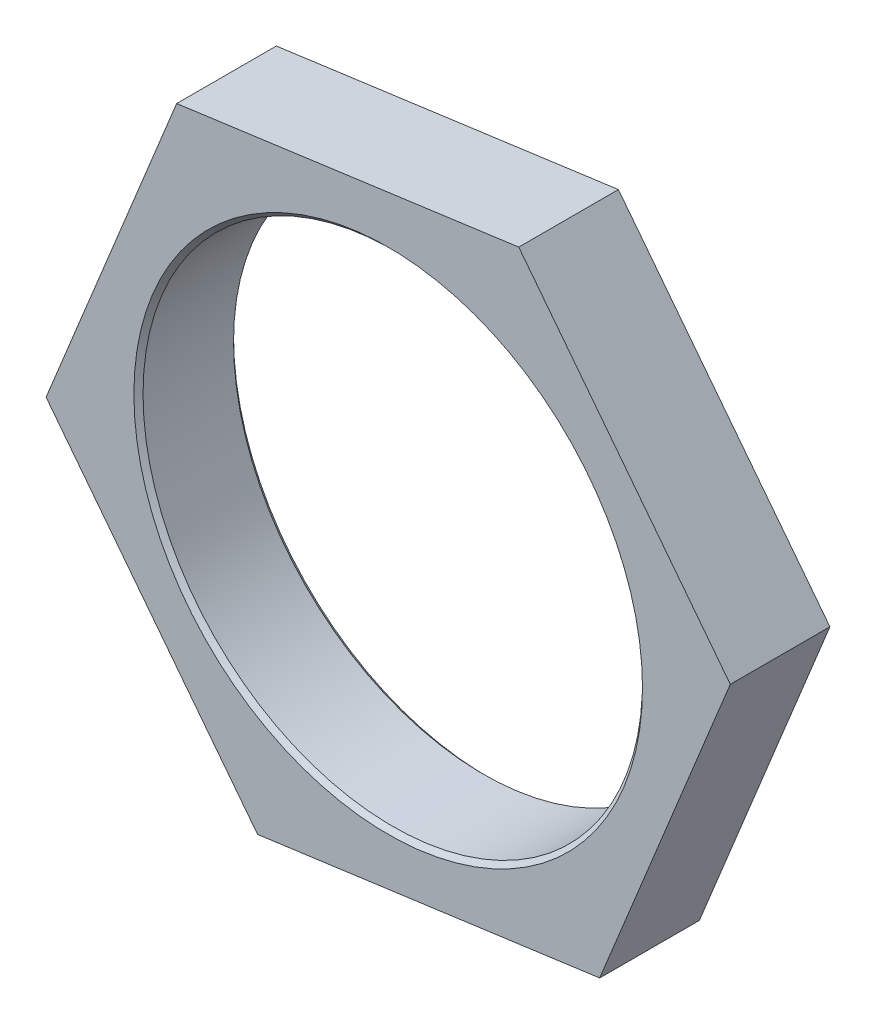
ISO-10303-21;
HEADER;
FILE_DESCRIPTION(('STEP AP214'),'2;1');
FILE_NAME('part.step','',(''),(''),'','','');
FILE_SCHEMA(('AUTOMOTIVE_DESIGN { 1 0 10303 214 1 1 1 1 }'));
ENDSEC;
DATA;
#1=APPLICATION_CONTEXT('core data for automotive mechanical design processes');
#2=APPLICATION_PROTOCOL_DEFINITION('international standard','automotive_design',2000,#1);
#3=PRODUCT_CONTEXT('',#1,'mechanical');
#4=PRODUCT('Part','Part','',(#3));
#5=PRODUCT_RELATED_PRODUCT_CATEGORY('part','',(#4));
#6=PRODUCT_DEFINITION_FORMATION('','',#4);
#7=PRODUCT_DEFINITION_CONTEXT('part definition',#1,'design');
#8=PRODUCT_DEFINITION('design','',#6,#7);
#9=PRODUCT_DEFINITION_SHAPE('','',#8);
#10=(LENGTH_UNIT() NAMED_UNIT(*) SI_UNIT(.MILLI.,.METRE.));
#11=(NAMED_UNIT(*) PLANE_ANGLE_UNIT() SI_UNIT($,.RADIAN.));
#12=(NAMED_UNIT(*) SI_UNIT($,.STERADIAN.) SOLID_ANGLE_UNIT());
#13=UNCERTAINTY_MEASURE_WITH_UNIT(LENGTH_MEASURE(1.E-05),#10,'distance_accuracy_value','');
#14=(GEOMETRIC_REPRESENTATION_CONTEXT(3) GLOBAL_UNCERTAINTY_ASSIGNED_CONTEXT((#13)) GLOBAL_UNIT_ASSIGNED_CONTEXT((#10,
#11,#12)) REPRESENTATION_CONTEXT('',''));
#15=CARTESIAN_POINT('',(0.,0.,0.));
#16=DIRECTION('',(0.,0.,1.));
#17=DIRECTION('',(1.,0.,0.));
#18=AXIS2_PLACEMENT_3D('',#15,#16,#17);
#19=CARTESIAN_POINT('',(0.,0.,-5.7));
#20=DIRECTION('',(0.,0.,-1.));
#21=DIRECTION('',(1.,0.,0.));
#22=AXIS2_PLACEMENT_3D('',#19,#20,#21);
#23=CONICAL_SURFACE('',#22,5.77,0.785398163397449);
#24=CARTESIAN_POINT('',(0.,0.,-5.69435));
#25=DIRECTION('',(0.,0.,1.));
#26=DIRECTION('',(1.,0.,0.));
#27=AXIS2_PLACEMENT_3D('',#24,#25,#26);
#28=CIRCLE('',#27,5.76435);
#29=CARTESIAN_POINT('',(-5.76435,0.,-5.69435));
#30=VERTEX_POINT('',#29);
#31=EDGE_CURVE('E10',#30,#30,#28,.T.);
#32=ORIENTED_EDGE('',*,*,#31,.T.);
#33=DIRECTION('',(-0.707106781186548,0.,-0.707106781186547));
#34=VECTOR('',#33,1.);
#35=CARTESIAN_POINT('',(-5.77,0.,-5.7));
#36=LINE('',#35,#34);
#37=CARTESIAN_POINT('',(-5.87,0.,-5.8));
#38=VERTEX_POINT('',#37);
#39=EDGE_CURVE('E27',#30,#38,#36,.T.);
#40=ORIENTED_EDGE('',*,*,#39,.T.);
#41=CARTESIAN_POINT('',(0.,0.,-5.8));
#42=DIRECTION('',(0.,0.,-1.));
#43=DIRECTION('',(1.,0.,0.));
#44=AXIS2_PLACEMENT_3D('',#41,#42,#43);
#45=CIRCLE('',#44,5.87);
#46=EDGE_CURVE('E159',#38,#38,#45,.T.);
#47=ORIENTED_EDGE('',*,*,#46,.T.);
#48=ORIENTED_EDGE('',*,*,#39,.F.);
#49=EDGE_LOOP('',(#32,#40,#47,#48));
#50=FACE_BOUND('',#49,.T.);
#51=ADVANCED_FACE('F16',(#50),#23,.F.);
#52=CARTESIAN_POINT('',(0.,0.,-5.8));
#53=DIRECTION('',(0.,0.,1.));
#54=DIRECTION('',(1.,0.,0.));
#55=AXIS2_PLACEMENT_3D('',#52,#53,#54);
#56=CYLINDRICAL_SURFACE('',#55,5.76435);
#57=CARTESIAN_POINT('',(0.,0.,-3.60565));
#58=DIRECTION('',(0.,0.,-1.));
#59=DIRECTION('',(1.,0.,0.));
#60=AXIS2_PLACEMENT_3D('',#57,#58,#59);
#61=CIRCLE('',#60,5.76435);
#62=CARTESIAN_POINT('',(-5.76435,0.,-3.60565));
#63=VERTEX_POINT('',#62);
#64=EDGE_CURVE('E168',#63,#63,#61,.T.);
#65=ORIENTED_EDGE('',*,*,#64,.F.);
#66=DIRECTION('',(0.,0.,-1.));
#67=VECTOR('',#66,1.);
#68=CARTESIAN_POINT('',(-5.76435,0.,-5.8));
#69=LINE('',#68,#67);
#70=EDGE_CURVE('E157',#63,#30,#69,.T.);
#71=ORIENTED_EDGE('',*,*,#70,.T.);
#72=ORIENTED_EDGE('',*,*,#31,.F.);
#73=ORIENTED_EDGE('',*,*,#70,.F.);
#74=EDGE_LOOP('',(#65,#71,#72,#73));
#75=FACE_BOUND('',#74,.T.);
#76=ADVANCED_FACE('F221',(#75),#56,.F.);
#77=CARTESIAN_POINT('',(0.,0.,-5.8));
#78=DIRECTION('',(0.,0.,1.));
#79=DIRECTION('',(1.,0.,0.));
#80=AXIS2_PLACEMENT_3D('',#77,#78,#79);
#81=PLANE('',#80);
#82=DIRECTION('',(0.378224107033803,0.925714062147963,0.));
#83=VECTOR('',#82,1.);
#84=CARTESIAN_POINT('',(4.88226133232146,-6.29955746722885,-5.8));
#85=LINE('',#84,#83);
#86=CARTESIAN_POINT('',(4.88226133232146,-6.29955746722885,-5.8));
#87=VERTEX_POINT('',#86);
#88=CARTESIAN_POINT('',(7.89670746538087,1.07838360809042,-5.8));
#89=VERTEX_POINT('',#88);
#90=EDGE_CURVE('E97',#87,#89,#85,.T.);
#91=ORIENTED_EDGE('',*,*,#90,.F.);
#92=DIRECTION('',(0.990803947977524,0.135305346059023,0.));
#93=VECTOR('',#92,1.);
#94=CARTESIAN_POINT('',(-3.01444613305941,-7.37794107531927,-5.8));
#95=LINE('',#94,#93);
#96=CARTESIAN_POINT('',(-3.01444613305941,-7.37794107531927,-5.8));
#97=VERTEX_POINT('',#96);
#98=EDGE_CURVE('E178',#97,#87,#95,.T.);
#99=ORIENTED_EDGE('',*,*,#98,.F.);
#100=DIRECTION('',(0.612579840943721,-0.790408716088939,0.));
#101=VECTOR('',#100,1.);
#102=CARTESIAN_POINT('',(-7.89670746538087,-1.07838360809042,-5.8));
#103=LINE('',#102,#101);
#104=CARTESIAN_POINT('',(-7.89670746538087,-1.07838360809042,-5.8));
#105=VERTEX_POINT('',#104);
#106=EDGE_CURVE('E108',#105,#97,#103,.T.);
#107=ORIENTED_EDGE('',*,*,#106,.F.);
#108=DIRECTION('',(-0.378224107033803,-0.925714062147963,0.));
#109=VECTOR('',#108,1.);
#110=CARTESIAN_POINT('',(-4.88226133232146,6.29955746722885,-5.8));
#111=LINE('',#110,#109);
#112=CARTESIAN_POINT('',(-4.88226133232146,6.29955746722885,-5.8));
#113=VERTEX_POINT('',#112);
#114=EDGE_CURVE('E155',#113,#105,#111,.T.);
#115=ORIENTED_EDGE('',*,*,#114,.F.);
#116=DIRECTION('',(-0.990803947977524,-0.135305346059024,0.));
#117=VECTOR('',#116,1.);
#118=CARTESIAN_POINT('',(3.01444613305941,7.37794107531927,-5.8));
#119=LINE('',#118,#117);
#120=CARTESIAN_POINT('',(3.01444613305941,7.37794107531927,-5.8));
#121=VERTEX_POINT('',#120);
#122=EDGE_CURVE('E138',#121,#113,#119,.T.);
#123=ORIENTED_EDGE('',*,*,#122,.F.);
#124=DIRECTION('',(-0.612579840943721,0.790408716088939,0.));
#125=VECTOR('',#124,1.);
#126=CARTESIAN_POINT('',(7.89670746538087,1.07838360809042,-5.8));
#127=LINE('',#126,#125);
#128=EDGE_CURVE('E133',#89,#121,#127,.T.);
#129=ORIENTED_EDGE('',*,*,#128,.F.);
#130=EDGE_LOOP('',(#91,#99,#107,#115,#123,#129));
#131=FACE_BOUND('',#130,.T.);
#132=ORIENTED_EDGE('',*,*,#46,.F.);
#133=EDGE_LOOP('',(#132));
#134=FACE_BOUND('',#133,.T.);
#135=ADVANCED_FACE('F134',(#131,#134),#81,.F.);
#136=CARTESIAN_POINT('',(0.,0.,-3.6));
#137=DIRECTION('',(0.,0.,1.));
#138=DIRECTION('',(1.,0.,0.));
#139=AXIS2_PLACEMENT_3D('',#136,#137,#138);
#140=CONICAL_SURFACE('',#139,5.77,0.785398163397448);
#141=CARTESIAN_POINT('',(0.,0.,-3.5));
#142=DIRECTION('',(0.,0.,1.));
#143=DIRECTION('',(1.,0.,0.));
#144=AXIS2_PLACEMENT_3D('',#141,#142,#143);
#145=CIRCLE('',#144,5.87);
#146=CARTESIAN_POINT('',(-5.87,0.,-3.5));
#147=VERTEX_POINT('',#146);
#148=EDGE_CURVE('E160',#147,#147,#145,.T.);
#149=ORIENTED_EDGE('',*,*,#148,.T.);
#150=DIRECTION('',(0.707106781186548,0.,-0.707106781186548));
#151=VECTOR('',#150,1.);
#152=CARTESIAN_POINT('',(-5.77,0.,-3.6));
#153=LINE('',#152,#151);
#154=EDGE_CURVE('E191',#147,#63,#153,.T.);
#155=ORIENTED_EDGE('',*,*,#154,.T.);
#156=ORIENTED_EDGE('',*,*,#64,.T.);
#157=ORIENTED_EDGE('',*,*,#154,.F.);
#158=EDGE_LOOP('',(#149,#155,#156,#157));
#159=FACE_BOUND('',#158,.T.);
#160=ADVANCED_FACE('F203',(#159),#140,.F.);
#161=CARTESIAN_POINT('',(0.,0.,-3.5));
#162=DIRECTION('',(0.,0.,1.));
#163=DIRECTION('',(1.,0.,0.));
#164=AXIS2_PLACEMENT_3D('',#161,#162,#163);
#165=PLANE('',#164);
#166=DIRECTION('',(0.378224107033803,0.925714062147963,0.));
#167=VECTOR('',#166,1.);
#168=CARTESIAN_POINT('',(4.88226133232146,-6.29955746722885,-3.5));
#169=LINE('',#168,#167);
#170=CARTESIAN_POINT('',(4.88226133232146,-6.29955746722885,-3.5));
#171=VERTEX_POINT('',#170);
#172=CARTESIAN_POINT('',(7.89670746538087,1.07838360809042,-3.5));
#173=VERTEX_POINT('',#172);
#174=EDGE_CURVE('E165',#171,#173,#169,.T.);
#175=ORIENTED_EDGE('',*,*,#174,.T.);
#176=DIRECTION('',(-0.612579840943721,0.790408716088939,0.));
#177=VECTOR('',#176,1.);
#178=CARTESIAN_POINT('',(7.89670746538087,1.07838360809042,-3.5));
#179=LINE('',#178,#177);
#180=CARTESIAN_POINT('',(3.01444613305941,7.37794107531927,-3.5));
#181=VERTEX_POINT('',#180);
#182=EDGE_CURVE('E147',#173,#181,#179,.T.);
#183=ORIENTED_EDGE('',*,*,#182,.T.);
#184=DIRECTION('',(-0.990803947977524,-0.135305346059024,0.));
#185=VECTOR('',#184,1.);
#186=CARTESIAN_POINT('',(3.01444613305941,7.37794107531927,-3.5));
#187=LINE('',#186,#185);
#188=CARTESIAN_POINT('',(-4.88226133232146,6.29955746722885,-3.5));
#189=VERTEX_POINT('',#188);
#190=EDGE_CURVE('E20',#181,#189,#187,.T.);
#191=ORIENTED_EDGE('',*,*,#190,.T.);
#192=DIRECTION('',(-0.378224107033803,-0.925714062147963,0.));
#193=VECTOR('',#192,1.);
#194=CARTESIAN_POINT('',(-4.88226133232146,6.29955746722885,-3.5));
#195=LINE('',#194,#193);
#196=CARTESIAN_POINT('',(-7.89670746538087,-1.07838360809042,-3.5));
#197=VERTEX_POINT('',#196);
#198=EDGE_CURVE('E170',#189,#197,#195,.T.);
#199=ORIENTED_EDGE('',*,*,#198,.T.);
#200=DIRECTION('',(0.612579840943721,-0.790408716088939,0.));
#201=VECTOR('',#200,1.);
#202=CARTESIAN_POINT('',(-7.89670746538087,-1.07838360809042,-3.5));
#203=LINE('',#202,#201);
#204=CARTESIAN_POINT('',(-3.01444613305941,-7.37794107531927,-3.5));
#205=VERTEX_POINT('',#204);
#206=EDGE_CURVE('E57',#197,#205,#203,.T.);
#207=ORIENTED_EDGE('',*,*,#206,.T.);
#208=DIRECTION('',(0.990803947977524,0.135305346059023,0.));
#209=VECTOR('',#208,1.);
#210=CARTESIAN_POINT('',(-3.01444613305941,-7.37794107531927,-3.5));
#211=LINE('',#210,#209);
#212=EDGE_CURVE('E71',#205,#171,#211,.T.);
#213=ORIENTED_EDGE('',*,*,#212,.T.);
#214=EDGE_LOOP('',(#175,#183,#191,#199,#207,#213));
#215=FACE_BOUND('',#214,.T.);
#216=ORIENTED_EDGE('',*,*,#148,.F.);
#217=EDGE_LOOP('',(#216));
#218=FACE_BOUND('',#217,.T.);
#219=ADVANCED_FACE('F206',(#215,#218),#165,.T.);
#220=CARTESIAN_POINT('',(-3.01444613305941,-7.37794107531927,-5.8));
#221=DIRECTION('',(0.135305346059023,-0.990803947977524,0.));
#222=DIRECTION('',(0.,0.,-1.));
#223=AXIS2_PLACEMENT_3D('',#220,#221,#222);
#224=PLANE('',#223);
#225=ORIENTED_EDGE('',*,*,#98,.T.);
#226=DIRECTION('',(0.,0.,1.));
#227=VECTOR('',#226,1.);
#228=CARTESIAN_POINT('',(4.88226133232146,-6.29955746722885,-5.8));
#229=LINE('',#228,#227);
#230=EDGE_CURVE('E128',#87,#171,#229,.T.);
#231=ORIENTED_EDGE('',*,*,#230,.T.);
#232=ORIENTED_EDGE('',*,*,#212,.F.);
#233=DIRECTION('',(0.,0.,1.));
#234=VECTOR('',#233,1.);
#235=CARTESIAN_POINT('',(-3.01444613305941,-7.37794107531927,-5.8));
#236=LINE('',#235,#234);
#237=EDGE_CURVE('E164',#97,#205,#236,.T.);
#238=ORIENTED_EDGE('',*,*,#237,.F.);
#239=EDGE_LOOP('',(#225,#231,#232,#238));
#240=FACE_BOUND('',#239,.T.);
#241=ADVANCED_FACE('F208',(#240),#224,.T.);
#242=CARTESIAN_POINT('',(-7.89670746538087,-1.07838360809042,-5.8));
#243=DIRECTION('',(-0.790408716088939,-0.612579840943721,0.));
#244=DIRECTION('',(-0.612579840943721,0.790408716088939,0.));
#245=AXIS2_PLACEMENT_3D('',#242,#243,#244);
#246=PLANE('',#245);
#247=ORIENTED_EDGE('',*,*,#106,.T.);
#248=ORIENTED_EDGE('',*,*,#237,.T.);
#249=ORIENTED_EDGE('',*,*,#206,.F.);
#250=DIRECTION('',(0.,0.,1.));
#251=VECTOR('',#250,1.);
#252=CARTESIAN_POINT('',(-7.89670746538087,-1.07838360809042,-5.8));
#253=LINE('',#252,#251);
#254=EDGE_CURVE('E181',#105,#197,#253,.T.);
#255=ORIENTED_EDGE('',*,*,#254,.F.);
#256=EDGE_LOOP('',(#247,#248,#249,#255));
#257=FACE_BOUND('',#256,.T.);
#258=ADVANCED_FACE('F215',(#257),#246,.T.);
#259=CARTESIAN_POINT('',(-4.88226133232146,6.29955746722885,-5.8));
#260=DIRECTION('',(-0.925714062147963,0.378224107033803,0.));
#261=DIRECTION('',(0.,0.,1.));
#262=AXIS2_PLACEMENT_3D('',#259,#260,#261);
#263=PLANE('',#262);
#264=ORIENTED_EDGE('',*,*,#114,.T.);
#265=ORIENTED_EDGE('',*,*,#254,.T.);
#266=ORIENTED_EDGE('',*,*,#198,.F.);
#267=DIRECTION('',(0.,0.,1.));
#268=VECTOR('',#267,1.);
#269=CARTESIAN_POINT('',(-4.88226133232146,6.29955746722885,-5.8));
#270=LINE('',#269,#268);
#271=EDGE_CURVE('E143',#113,#189,#270,.T.);
#272=ORIENTED_EDGE('',*,*,#271,.F.);
#273=EDGE_LOOP('',(#264,#265,#266,#272));
#274=FACE_BOUND('',#273,.T.);
#275=ADVANCED_FACE('F18',(#274),#263,.T.);
#276=CARTESIAN_POINT('',(3.01444613305941,7.37794107531927,-5.8));
#277=DIRECTION('',(-0.135305346059024,0.990803947977524,0.));
#278=DIRECTION('',(0.,0.,1.));
#279=AXIS2_PLACEMENT_3D('',#276,#277,#278);
#280=PLANE('',#279);
#281=ORIENTED_EDGE('',*,*,#122,.T.);
#282=ORIENTED_EDGE('',*,*,#271,.T.);
#283=ORIENTED_EDGE('',*,*,#190,.F.);
#284=DIRECTION('',(0.,0.,1.));
#285=VECTOR('',#284,1.);
#286=CARTESIAN_POINT('',(3.01444613305941,7.37794107531927,-5.8));
#287=LINE('',#286,#285);
#288=EDGE_CURVE('E130',#121,#181,#287,.T.);
#289=ORIENTED_EDGE('',*,*,#288,.F.);
#290=EDGE_LOOP('',(#281,#282,#283,#289));
#291=FACE_BOUND('',#290,.T.);
#292=ADVANCED_FACE('F228',(#291),#280,.T.);
#293=CARTESIAN_POINT('',(7.89670746538087,1.07838360809042,-5.8));
#294=DIRECTION('',(0.790408716088939,0.612579840943721,0.));
#295=DIRECTION('',(0.,0.,-1.));
#296=AXIS2_PLACEMENT_3D('',#293,#294,#295);
#297=PLANE('',#296);
#298=ORIENTED_EDGE('',*,*,#128,.T.);
#299=ORIENTED_EDGE('',*,*,#288,.T.);
#300=ORIENTED_EDGE('',*,*,#182,.F.);
#301=DIRECTION('',(0.,0.,1.));
#302=VECTOR('',#301,1.);
#303=CARTESIAN_POINT('',(7.89670746538087,1.07838360809042,-5.8));
#304=LINE('',#303,#302);
#305=EDGE_CURVE('E127',#89,#173,#304,.T.);
#306=ORIENTED_EDGE('',*,*,#305,.F.);
#307=EDGE_LOOP('',(#298,#299,#300,#306));
#308=FACE_BOUND('',#307,.T.);
#309=ADVANCED_FACE('F145',(#308),#297,.T.);
#310=CARTESIAN_POINT('',(4.88226133232146,-6.29955746722885,-5.8));
#311=DIRECTION('',(0.925714062147963,-0.378224107033803,0.));
#312=DIRECTION('',(0.,0.,-1.));
#313=AXIS2_PLACEMENT_3D('',#310,#311,#312);
#314=PLANE('',#313);
#315=ORIENTED_EDGE('',*,*,#90,.T.);
#316=ORIENTED_EDGE('',*,*,#305,.T.);
#317=ORIENTED_EDGE('',*,*,#174,.F.);
#318=ORIENTED_EDGE('',*,*,#230,.F.);
#319=EDGE_LOOP('',(#315,#316,#317,#318));
#320=FACE_BOUND('',#319,.T.);
#321=ADVANCED_FACE('F125',(#320),#314,.T.);
#322=CLOSED_SHELL('',(#51,#76,#135,#160,#219,#241,#258,#275,#292,#309,#321));
#323=MANIFOLD_SOLID_BREP('B1',#322);
#324=ADVANCED_BREP_SHAPE_REPRESENTATION('',(#18,#323),#14);
#325=SHAPE_DEFINITION_REPRESENTATION(#9,#324);
ENDSEC;
END-ISO-10303-21;
